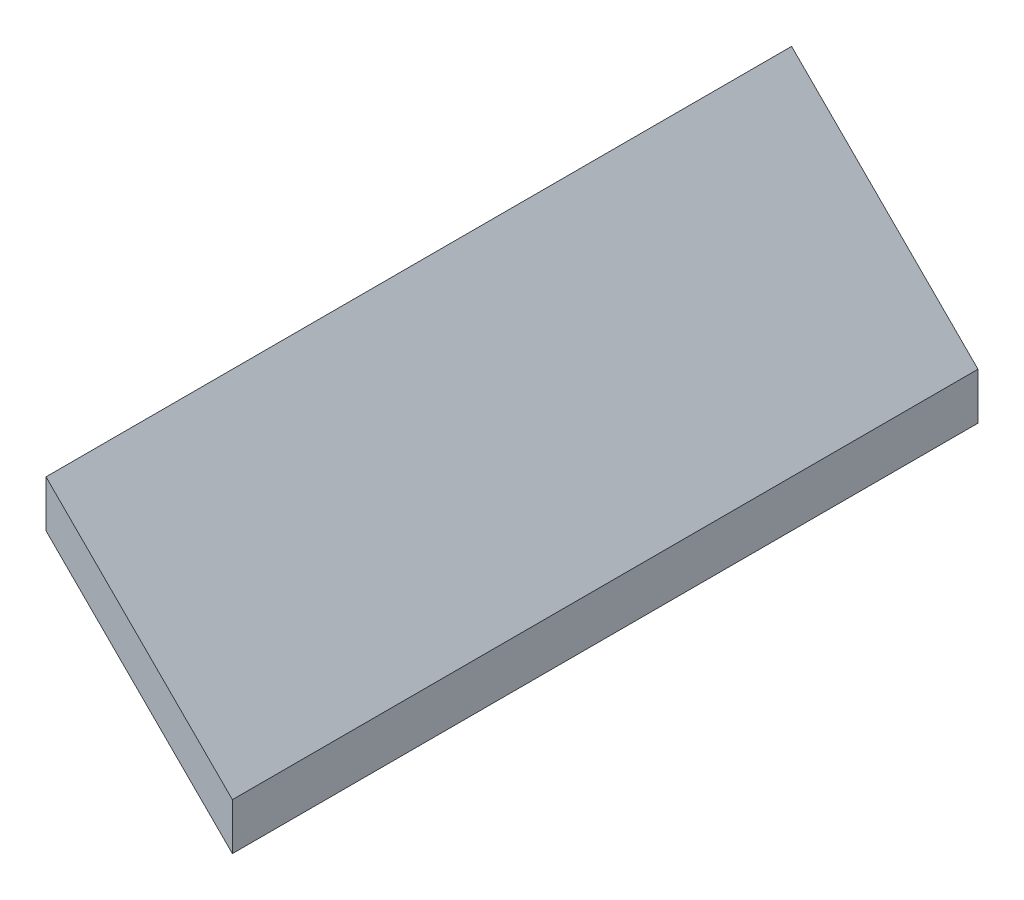
ISO-10303-21;
HEADER;
FILE_DESCRIPTION(('STEP AP214'),'2;1');
FILE_NAME('part.step','',(''),(''),'','','');
FILE_SCHEMA(('AUTOMOTIVE_DESIGN { 1 0 10303 214 1 1 1 1 }'));
ENDSEC;
DATA;
#1=APPLICATION_CONTEXT('core data for automotive mechanical design processes');
#2=APPLICATION_PROTOCOL_DEFINITION('international standard','automotive_design',2000,#1);
#3=PRODUCT_CONTEXT('',#1,'mechanical');
#4=PRODUCT('Part','Part','',(#3));
#5=PRODUCT_RELATED_PRODUCT_CATEGORY('part','',(#4));
#6=PRODUCT_DEFINITION_FORMATION('','',#4);
#7=PRODUCT_DEFINITION_CONTEXT('part definition',#1,'design');
#8=PRODUCT_DEFINITION('design','',#6,#7);
#9=PRODUCT_DEFINITION_SHAPE('','',#8);
#10=(LENGTH_UNIT() NAMED_UNIT(*) SI_UNIT(.MILLI.,.METRE.));
#11=(NAMED_UNIT(*) PLANE_ANGLE_UNIT() SI_UNIT($,.RADIAN.));
#12=(NAMED_UNIT(*) SI_UNIT($,.STERADIAN.) SOLID_ANGLE_UNIT());
#13=UNCERTAINTY_MEASURE_WITH_UNIT(LENGTH_MEASURE(1.E-05),#10,'distance_accuracy_value','');
#14=(GEOMETRIC_REPRESENTATION_CONTEXT(3) GLOBAL_UNCERTAINTY_ASSIGNED_CONTEXT((#13)) GLOBAL_UNIT_ASSIGNED_CONTEXT((#10,
#11,#12)) REPRESENTATION_CONTEXT('',''));
#15=CARTESIAN_POINT('',(0.,0.,0.));
#16=DIRECTION('',(0.,0.,1.));
#17=DIRECTION('',(1.,0.,0.));
#18=AXIS2_PLACEMENT_3D('',#15,#16,#17);
#19=CARTESIAN_POINT('',(19.05,-19.0499999999999,76.2));
#20=DIRECTION('',(-0.707106781186546,-0.707106781186549,0.));
#21=DIRECTION('',(0.707106781186549,-0.707106781186546,0.));
#22=AXIS2_PLACEMENT_3D('',#19,#20,#21);
#23=PLANE('',#22);
#24=DIRECTION('',(-0.707106781186549,0.707106781186546,0.));
#25=VECTOR('',#24,1.);
#26=CARTESIAN_POINT('',(19.05,-19.0499999999999,0.));
#27=LINE('',#26,#25);
#28=CARTESIAN_POINT('',(19.05,-19.0499999999999,0.));
#29=VERTEX_POINT('',#28);
#30=CARTESIAN_POINT('',(0.,0.,0.));
#31=VERTEX_POINT('',#30);
#32=EDGE_CURVE('E111',#29,#31,#27,.T.);
#33=ORIENTED_EDGE('',*,*,#32,.T.);
#34=DIRECTION('',(0.,0.,-1.));
#35=VECTOR('',#34,1.);
#36=CARTESIAN_POINT('',(0.,0.,76.2));
#37=LINE('',#36,#35);
#38=CARTESIAN_POINT('',(0.,0.,76.2));
#39=VERTEX_POINT('',#38);
#40=EDGE_CURVE('E11',#39,#31,#37,.T.);
#41=ORIENTED_EDGE('',*,*,#40,.F.);
#42=DIRECTION('',(-0.707106781186549,0.707106781186546,0.));
#43=VECTOR('',#42,1.);
#44=CARTESIAN_POINT('',(19.05,-19.0499999999999,76.2));
#45=LINE('',#44,#43);
#46=CARTESIAN_POINT('',(19.05,-19.0499999999999,76.2));
#47=VERTEX_POINT('',#46);
#48=EDGE_CURVE('E95',#47,#39,#45,.T.);
#49=ORIENTED_EDGE('',*,*,#48,.F.);
#50=DIRECTION('',(0.,0.,-1.));
#51=VECTOR('',#50,1.);
#52=CARTESIAN_POINT('',(19.05,-19.0499999999999,76.2));
#53=LINE('',#52,#51);
#54=EDGE_CURVE('E107',#47,#29,#53,.T.);
#55=ORIENTED_EDGE('',*,*,#54,.T.);
#56=EDGE_LOOP('',(#33,#41,#49,#55));
#57=FACE_BOUND('',#56,.T.);
#58=ADVANCED_FACE('F43',(#57),#23,.F.);
#59=CARTESIAN_POINT('',(0.,0.,76.2));
#60=DIRECTION('',(1.,0.,0.));
#61=DIRECTION('',(0.,0.,-1.));
#62=AXIS2_PLACEMENT_3D('',#59,#60,#61);
#63=PLANE('',#62);
#64=DIRECTION('',(0.,-1.,0.));
#65=VECTOR('',#64,1.);
#66=CARTESIAN_POINT('',(0.,0.,0.));
#67=LINE('',#66,#65);
#68=CARTESIAN_POINT('',(0.,-4.7752,0.));
#69=VERTEX_POINT('',#68);
#70=EDGE_CURVE('E100',#31,#69,#67,.T.);
#71=ORIENTED_EDGE('',*,*,#70,.T.);
#72=DIRECTION('',(0.,0.,-1.));
#73=VECTOR('',#72,1.);
#74=CARTESIAN_POINT('',(0.,-4.7752,76.2));
#75=LINE('',#74,#73);
#76=CARTESIAN_POINT('',(0.,-4.7752,76.2));
#77=VERTEX_POINT('',#76);
#78=EDGE_CURVE('E52',#77,#69,#75,.T.);
#79=ORIENTED_EDGE('',*,*,#78,.F.);
#80=DIRECTION('',(0.,-1.,0.));
#81=VECTOR('',#80,1.);
#82=CARTESIAN_POINT('',(0.,0.,76.2));
#83=LINE('',#82,#81);
#84=EDGE_CURVE('E90',#39,#77,#83,.T.);
#85=ORIENTED_EDGE('',*,*,#84,.F.);
#86=ORIENTED_EDGE('',*,*,#40,.T.);
#87=EDGE_LOOP('',(#71,#79,#85,#86));
#88=FACE_BOUND('',#87,.T.);
#89=ADVANCED_FACE('F99',(#88),#63,.F.);
#90=CARTESIAN_POINT('',(0.,-4.7752,76.2));
#91=DIRECTION('',(0.707106781186546,0.707106781186549,0.));
#92=DIRECTION('',(-0.707106781186549,0.707106781186546,0.));
#93=AXIS2_PLACEMENT_3D('',#90,#91,#92);
#94=PLANE('',#93);
#95=DIRECTION('',(0.707106781186549,-0.707106781186546,0.));
#96=VECTOR('',#95,1.);
#97=CARTESIAN_POINT('',(0.,-4.7752,0.));
#98=LINE('',#97,#96);
#99=CARTESIAN_POINT('',(19.05,-23.8251999999999,0.));
#100=VERTEX_POINT('',#99);
#101=EDGE_CURVE('E77',#69,#100,#98,.T.);
#102=ORIENTED_EDGE('',*,*,#101,.T.);
#103=DIRECTION('',(0.,0.,-1.));
#104=VECTOR('',#103,1.);
#105=CARTESIAN_POINT('',(19.05,-23.8251999999999,76.2));
#106=LINE('',#105,#104);
#107=CARTESIAN_POINT('',(19.05,-23.8251999999999,76.2));
#108=VERTEX_POINT('',#107);
#109=EDGE_CURVE('E102',#108,#100,#106,.T.);
#110=ORIENTED_EDGE('',*,*,#109,.F.);
#111=DIRECTION('',(0.707106781186549,-0.707106781186546,0.));
#112=VECTOR('',#111,1.);
#113=CARTESIAN_POINT('',(0.,-4.7752,76.2));
#114=LINE('',#113,#112);
#115=EDGE_CURVE('E93',#77,#108,#114,.T.);
#116=ORIENTED_EDGE('',*,*,#115,.F.);
#117=ORIENTED_EDGE('',*,*,#78,.T.);
#118=EDGE_LOOP('',(#102,#110,#116,#117));
#119=FACE_BOUND('',#118,.T.);
#120=ADVANCED_FACE('F103',(#119),#94,.F.);
#121=CARTESIAN_POINT('',(19.05,-23.8251999999999,76.2));
#122=DIRECTION('',(-1.,0.,0.));
#123=DIRECTION('',(0.,-1.,0.));
#124=AXIS2_PLACEMENT_3D('',#121,#122,#123);
#125=PLANE('',#124);
#126=DIRECTION('',(0.,1.,0.));
#127=VECTOR('',#126,1.);
#128=CARTESIAN_POINT('',(19.05,-23.8251999999999,0.));
#129=LINE('',#128,#127);
#130=EDGE_CURVE('E83',#100,#29,#129,.T.);
#131=ORIENTED_EDGE('',*,*,#130,.T.);
#132=ORIENTED_EDGE('',*,*,#54,.F.);
#133=DIRECTION('',(0.,1.,0.));
#134=VECTOR('',#133,1.);
#135=CARTESIAN_POINT('',(19.05,-23.8251999999999,76.2));
#136=LINE('',#135,#134);
#137=EDGE_CURVE('E60',#108,#47,#136,.T.);
#138=ORIENTED_EDGE('',*,*,#137,.F.);
#139=ORIENTED_EDGE('',*,*,#109,.T.);
#140=EDGE_LOOP('',(#131,#132,#138,#139));
#141=FACE_BOUND('',#140,.T.);
#142=ADVANCED_FACE('F124',(#141),#125,.F.);
#143=CARTESIAN_POINT('',(0.,0.,76.2));
#144=DIRECTION('',(0.,0.,1.));
#145=DIRECTION('',(1.,0.,0.));
#146=AXIS2_PLACEMENT_3D('',#143,#144,#145);
#147=PLANE('',#146);
#148=ORIENTED_EDGE('',*,*,#48,.T.);
#149=ORIENTED_EDGE('',*,*,#84,.T.);
#150=ORIENTED_EDGE('',*,*,#115,.T.);
#151=ORIENTED_EDGE('',*,*,#137,.T.);
#152=EDGE_LOOP('',(#148,#149,#150,#151));
#153=FACE_BOUND('',#152,.T.);
#154=ADVANCED_FACE('F91',(#153),#147,.T.);
#155=CARTESIAN_POINT('',(0.,0.,0.));
#156=DIRECTION('',(0.,0.,1.));
#157=DIRECTION('',(1.,0.,0.));
#158=AXIS2_PLACEMENT_3D('',#155,#156,#157);
#159=PLANE('',#158);
#160=ORIENTED_EDGE('',*,*,#32,.F.);
#161=ORIENTED_EDGE('',*,*,#130,.F.);
#162=ORIENTED_EDGE('',*,*,#101,.F.);
#163=ORIENTED_EDGE('',*,*,#70,.F.);
#164=EDGE_LOOP('',(#160,#161,#162,#163));
#165=FACE_BOUND('',#164,.T.);
#166=ADVANCED_FACE('F127',(#165),#159,.F.);
#167=CLOSED_SHELL('',(#58,#89,#120,#142,#154,#166));
#168=MANIFOLD_SOLID_BREP('B2',#167);
#169=ADVANCED_BREP_SHAPE_REPRESENTATION('',(#18,#168),#14);
#170=SHAPE_DEFINITION_REPRESENTATION(#9,#169);
ENDSEC;
END-ISO-10303-21;
